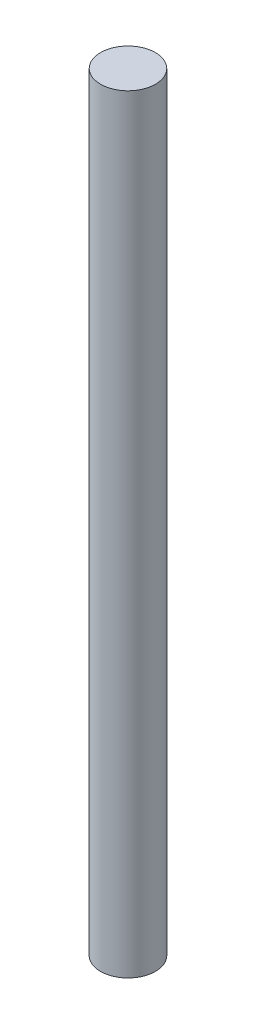
ISO-10303-21;
HEADER;
FILE_DESCRIPTION(('STEP AP214'),'2;1');
FILE_NAME('part.step','',(''),(''),'','','');
FILE_SCHEMA(('AUTOMOTIVE_DESIGN { 1 0 10303 214 1 1 1 1 }'));
ENDSEC;
DATA;
#1=APPLICATION_CONTEXT('core data for automotive mechanical design processes');
#2=APPLICATION_PROTOCOL_DEFINITION('international standard','automotive_design',2000,#1);
#3=PRODUCT_CONTEXT('',#1,'mechanical');
#4=PRODUCT('Part','Part','',(#3));
#5=PRODUCT_RELATED_PRODUCT_CATEGORY('part','',(#4));
#6=PRODUCT_DEFINITION_FORMATION('','',#4);
#7=PRODUCT_DEFINITION_CONTEXT('part definition',#1,'design');
#8=PRODUCT_DEFINITION('design','',#6,#7);
#9=PRODUCT_DEFINITION_SHAPE('','',#8);
#10=(LENGTH_UNIT() NAMED_UNIT(*) SI_UNIT(.MILLI.,.METRE.));
#11=(NAMED_UNIT(*) PLANE_ANGLE_UNIT() SI_UNIT($,.RADIAN.));
#12=(NAMED_UNIT(*) SI_UNIT($,.STERADIAN.) SOLID_ANGLE_UNIT());
#13=UNCERTAINTY_MEASURE_WITH_UNIT(LENGTH_MEASURE(1.E-05),#10,'distance_accuracy_value','');
#14=(GEOMETRIC_REPRESENTATION_CONTEXT(3) GLOBAL_UNCERTAINTY_ASSIGNED_CONTEXT((#13)) GLOBAL_UNIT_ASSIGNED_CONTEXT((#10,
#11,#12)) REPRESENTATION_CONTEXT('',''));
#15=CARTESIAN_POINT('',(0.,0.,0.));
#16=DIRECTION('',(0.,0.,1.));
#17=DIRECTION('',(1.,0.,0.));
#18=AXIS2_PLACEMENT_3D('',#15,#16,#17);
#19=CARTESIAN_POINT('',(0.,112.,0.));
#20=DIRECTION('',(0.,-1.,0.));
#21=DIRECTION('',(0.,0.,-1.));
#22=AXIS2_PLACEMENT_3D('',#19,#20,#21);
#23=CYLINDRICAL_SURFACE('',#22,4.);
#24=CARTESIAN_POINT('',(0.,112.,0.));
#25=DIRECTION('',(0.,1.,0.));
#26=DIRECTION('',(0.,0.,1.));
#27=AXIS2_PLACEMENT_3D('',#24,#25,#26);
#28=CIRCLE('',#27,4.);
#29=CARTESIAN_POINT('',(0.,112.,4.));
#30=VERTEX_POINT('',#29);
#31=EDGE_CURVE('E10',#30,#30,#28,.T.);
#32=ORIENTED_EDGE('',*,*,#31,.F.);
#33=EDGE_LOOP('',(#32));
#34=FACE_BOUND('',#33,.T.);
#35=CARTESIAN_POINT('',(0.,0.,0.));
#36=DIRECTION('',(0.,1.,0.));
#37=DIRECTION('',(0.,0.,1.));
#38=AXIS2_PLACEMENT_3D('',#35,#36,#37);
#39=CIRCLE('',#38,4.);
#40=CARTESIAN_POINT('',(0.,0.,4.));
#41=VERTEX_POINT('',#40);
#42=EDGE_CURVE('E46',#41,#41,#39,.T.);
#43=ORIENTED_EDGE('',*,*,#42,.T.);
#44=EDGE_LOOP('',(#43));
#45=FACE_BOUND('',#44,.T.);
#46=ADVANCED_FACE('F43',(#34,#45),#23,.T.);
#47=CARTESIAN_POINT('',(0.,112.,0.));
#48=DIRECTION('',(0.,1.,0.));
#49=DIRECTION('',(0.,0.,1.));
#50=AXIS2_PLACEMENT_3D('',#47,#48,#49);
#51=PLANE('',#50);
#52=ORIENTED_EDGE('',*,*,#31,.T.);
#53=EDGE_LOOP('',(#52));
#54=FACE_BOUND('',#53,.T.);
#55=ADVANCED_FACE('F60',(#54),#51,.T.);
#56=CARTESIAN_POINT('',(0.,0.,0.));
#57=DIRECTION('',(0.,1.,0.));
#58=DIRECTION('',(0.,0.,1.));
#59=AXIS2_PLACEMENT_3D('',#56,#57,#58);
#60=PLANE('',#59);
#61=ORIENTED_EDGE('',*,*,#42,.F.);
#62=EDGE_LOOP('',(#61));
#63=FACE_BOUND('',#62,.T.);
#64=ADVANCED_FACE('F58',(#63),#60,.F.);
#65=CLOSED_SHELL('',(#46,#55,#64));
#66=MANIFOLD_SOLID_BREP('B2',#65);
#67=ADVANCED_BREP_SHAPE_REPRESENTATION('',(#18,#66),#14);
#68=SHAPE_DEFINITION_REPRESENTATION(#9,#67);
ENDSEC;
END-ISO-10303-21;
